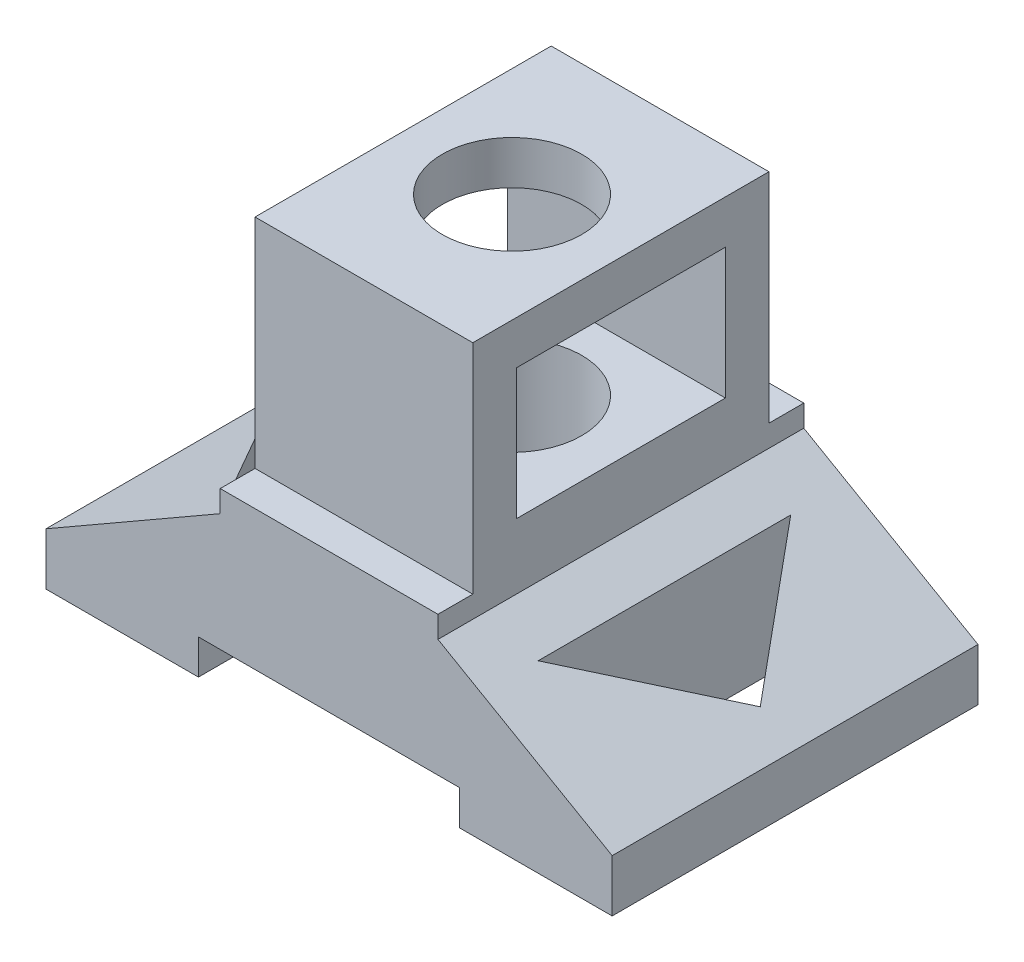
ISO-10303-21;
HEADER;
FILE_DESCRIPTION(('STEP AP214'),'2;1');
FILE_NAME('part.step','',(''),(''),'','','');
FILE_SCHEMA(('AUTOMOTIVE_DESIGN { 1 0 10303 214 1 1 1 1 }'));
ENDSEC;
DATA;
#1=APPLICATION_CONTEXT('core data for automotive mechanical design processes');
#2=APPLICATION_PROTOCOL_DEFINITION('international standard','automotive_design',2000,#1);
#3=PRODUCT_CONTEXT('',#1,'mechanical');
#4=PRODUCT('Part','Part','',(#3));
#5=PRODUCT_RELATED_PRODUCT_CATEGORY('part','',(#4));
#6=PRODUCT_DEFINITION_FORMATION('','',#4);
#7=PRODUCT_DEFINITION_CONTEXT('part definition',#1,'design');
#8=PRODUCT_DEFINITION('design','',#6,#7);
#9=PRODUCT_DEFINITION_SHAPE('','',#8);
#10=(LENGTH_UNIT() NAMED_UNIT(*) SI_UNIT(.MILLI.,.METRE.));
#11=(NAMED_UNIT(*) PLANE_ANGLE_UNIT() SI_UNIT($,.RADIAN.));
#12=(NAMED_UNIT(*) SI_UNIT($,.STERADIAN.) SOLID_ANGLE_UNIT());
#13=UNCERTAINTY_MEASURE_WITH_UNIT(LENGTH_MEASURE(1.E-05),#10,'distance_accuracy_value','');
#14=(GEOMETRIC_REPRESENTATION_CONTEXT(3) GLOBAL_UNCERTAINTY_ASSIGNED_CONTEXT((#13)) GLOBAL_UNIT_ASSIGNED_CONTEXT((#10,
#11,#12)) REPRESENTATION_CONTEXT('',''));
#15=CARTESIAN_POINT('',(0.,0.,0.));
#16=DIRECTION('',(0.,0.,1.));
#17=DIRECTION('',(1.,0.,0.));
#18=AXIS2_PLACEMENT_3D('',#15,#16,#17);
#19=CARTESIAN_POINT('',(0.,40.,-42.));
#20=DIRECTION('',(0.,-1.,0.));
#21=DIRECTION('',(1.,0.,0.));
#22=AXIS2_PLACEMENT_3D('',#19,#20,#21);
#23=PLANE('',#22);
#24=DIRECTION('',(1.,0.,0.));
#25=VECTOR('',#24,1.);
#26=CARTESIAN_POINT('',(0.,40.,34.));
#27=LINE('',#26,#25);
#28=CARTESIAN_POINT('',(-25.,40.,34.));
#29=VERTEX_POINT('',#28);
#30=CARTESIAN_POINT('',(25.,40.,34.));
#31=VERTEX_POINT('',#30);
#32=EDGE_CURVE('E326',#29,#31,#27,.T.);
#33=ORIENTED_EDGE('',*,*,#32,.F.);
#34=DIRECTION('',(0.,0.,1.));
#35=VECTOR('',#34,1.);
#36=CARTESIAN_POINT('',(-25.,40.,-42.));
#37=LINE('',#36,#35);
#38=CARTESIAN_POINT('',(-25.,40.,42.));
#39=VERTEX_POINT('',#38);
#40=EDGE_CURVE('E448',#29,#39,#37,.T.);
#41=ORIENTED_EDGE('',*,*,#40,.T.);
#42=DIRECTION('',(1.,0.,0.));
#43=VECTOR('',#42,1.);
#44=CARTESIAN_POINT('',(0.,40.,42.));
#45=LINE('',#44,#43);
#46=CARTESIAN_POINT('',(25.,40.,42.));
#47=VERTEX_POINT('',#46);
#48=EDGE_CURVE('E356',#39,#47,#45,.T.);
#49=ORIENTED_EDGE('',*,*,#48,.T.);
#50=DIRECTION('',(0.,0.,1.));
#51=VECTOR('',#50,1.);
#52=CARTESIAN_POINT('',(25.,40.,-42.));
#53=LINE('',#52,#51);
#54=EDGE_CURVE('E454',#31,#47,#53,.T.);
#55=ORIENTED_EDGE('',*,*,#54,.F.);
#56=EDGE_LOOP('',(#33,#41,#49,#55));
#57=FACE_BOUND('',#56,.T.);
#58=ADVANCED_FACE('F47',(#57),#23,.F.);
#59=CARTESIAN_POINT('',(-25.,40.,-42.));
#60=VERTEX_POINT('',#59);
#61=CARTESIAN_POINT('',(-25.,40.,-34.));
#62=VERTEX_POINT('',#61);
#63=EDGE_CURVE('E485',#60,#62,#37,.T.);
#64=ORIENTED_EDGE('',*,*,#63,.T.);
#65=DIRECTION('',(1.,0.,0.));
#66=VECTOR('',#65,1.);
#67=CARTESIAN_POINT('',(0.,40.,-34.));
#68=LINE('',#67,#66);
#69=CARTESIAN_POINT('',(25.,40.,-34.));
#70=VERTEX_POINT('',#69);
#71=EDGE_CURVE('E340',#62,#70,#68,.T.);
#72=ORIENTED_EDGE('',*,*,#71,.T.);
#73=CARTESIAN_POINT('',(25.,40.,-42.));
#74=VERTEX_POINT('',#73);
#75=EDGE_CURVE('E449',#74,#70,#53,.T.);
#76=ORIENTED_EDGE('',*,*,#75,.F.);
#77=DIRECTION('',(1.,0.,0.));
#78=VECTOR('',#77,1.);
#79=CARTESIAN_POINT('',(0.,40.,-42.));
#80=LINE('',#79,#78);
#81=EDGE_CURVE('E406',#60,#74,#80,.T.);
#82=ORIENTED_EDGE('',*,*,#81,.F.);
#83=EDGE_LOOP('',(#64,#72,#76,#82));
#84=FACE_BOUND('',#83,.T.);
#85=ADVANCED_FACE('F49',(#84),#23,.F.);
#86=CARTESIAN_POINT('',(25.,0.,-42.));
#87=DIRECTION('',(1.,0.,0.));
#88=DIRECTION('',(0.,0.,-1.));
#89=AXIS2_PLACEMENT_3D('',#86,#87,#88);
#90=PLANE('',#89);
#91=DIRECTION('',(0.,-1.,0.));
#92=VECTOR('',#91,1.);
#93=CARTESIAN_POINT('',(25.,80.,24.));
#94=LINE('',#93,#92);
#95=CARTESIAN_POINT('',(25.,80.,24.));
#96=VERTEX_POINT('',#95);
#97=CARTESIAN_POINT('',(25.,50.,24.));
#98=VERTEX_POINT('',#97);
#99=EDGE_CURVE('E294',#96,#98,#94,.T.);
#100=ORIENTED_EDGE('',*,*,#99,.F.);
#101=DIRECTION('',(0.,0.,1.));
#102=VECTOR('',#101,1.);
#103=CARTESIAN_POINT('',(25.,80.,24.));
#104=LINE('',#103,#102);
#105=CARTESIAN_POINT('',(25.,80.,-24.));
#106=VERTEX_POINT('',#105);
#107=EDGE_CURVE('E305',#106,#96,#104,.T.);
#108=ORIENTED_EDGE('',*,*,#107,.F.);
#109=DIRECTION('',(0.,1.,0.));
#110=VECTOR('',#109,1.);
#111=CARTESIAN_POINT('',(25.,80.,-24.));
#112=LINE('',#111,#110);
#113=CARTESIAN_POINT('',(25.,50.,-24.));
#114=VERTEX_POINT('',#113);
#115=EDGE_CURVE('E301',#114,#106,#112,.T.);
#116=ORIENTED_EDGE('',*,*,#115,.F.);
#117=DIRECTION('',(0.,0.,-1.));
#118=VECTOR('',#117,1.);
#119=CARTESIAN_POINT('',(25.,50.,24.));
#120=LINE('',#119,#118);
#121=EDGE_CURVE('E297',#98,#114,#120,.T.);
#122=ORIENTED_EDGE('',*,*,#121,.F.);
#123=EDGE_LOOP('',(#100,#108,#116,#122));
#124=FACE_BOUND('',#123,.T.);
#125=ORIENTED_EDGE('',*,*,#75,.T.);
#126=DIRECTION('',(0.,1.,0.));
#127=VECTOR('',#126,1.);
#128=CARTESIAN_POINT('',(25.,0.,-34.));
#129=LINE('',#128,#127);
#130=CARTESIAN_POINT('',(25.,90.,-34.));
#131=VERTEX_POINT('',#130);
#132=EDGE_CURVE('E344',#70,#131,#129,.T.);
#133=ORIENTED_EDGE('',*,*,#132,.T.);
#134=DIRECTION('',(0.,0.,1.));
#135=VECTOR('',#134,1.);
#136=CARTESIAN_POINT('',(25.,90.,-34.));
#137=LINE('',#136,#135);
#138=CARTESIAN_POINT('',(25.,90.,34.));
#139=VERTEX_POINT('',#138);
#140=EDGE_CURVE('E352',#131,#139,#137,.T.);
#141=ORIENTED_EDGE('',*,*,#140,.T.);
#142=DIRECTION('',(0.,1.,0.));
#143=VECTOR('',#142,1.);
#144=CARTESIAN_POINT('',(25.,0.,34.));
#145=LINE('',#144,#143);
#146=EDGE_CURVE('E329',#31,#139,#145,.T.);
#147=ORIENTED_EDGE('',*,*,#146,.F.);
#148=ORIENTED_EDGE('',*,*,#54,.T.);
#149=DIRECTION('',(0.,1.,0.));
#150=VECTOR('',#149,1.);
#151=CARTESIAN_POINT('',(25.,0.,42.));
#152=LINE('',#151,#150);
#153=CARTESIAN_POINT('',(25.,35.,42.));
#154=VERTEX_POINT('',#153);
#155=EDGE_CURVE('E402',#154,#47,#152,.T.);
#156=ORIENTED_EDGE('',*,*,#155,.F.);
#157=DIRECTION('',(0.,0.,1.));
#158=VECTOR('',#157,1.);
#159=CARTESIAN_POINT('',(25.,35.,-42.));
#160=LINE('',#159,#158);
#161=CARTESIAN_POINT('',(25.,35.,-42.));
#162=VERTEX_POINT('',#161);
#163=EDGE_CURVE('E455',#162,#154,#160,.T.);
#164=ORIENTED_EDGE('',*,*,#163,.F.);
#165=DIRECTION('',(0.,1.,0.));
#166=VECTOR('',#165,1.);
#167=CARTESIAN_POINT('',(25.,0.,-42.));
#168=LINE('',#167,#166);
#169=EDGE_CURVE('E444',#162,#74,#168,.T.);
#170=ORIENTED_EDGE('',*,*,#169,.T.);
#171=EDGE_LOOP('',(#125,#133,#141,#147,#148,#156,#164,#170));
#172=FACE_BOUND('',#171,.T.);
#173=ADVANCED_FACE('F535',(#124,#172),#90,.T.);
#174=CARTESIAN_POINT('',(21.3363081258807,37.1066228276186,-42.));
#175=DIRECTION('',(0.498471124258083,0.866906303057535,0.));
#176=DIRECTION('',(-0.866906303057535,0.498471124258083,0.));
#177=AXIS2_PLACEMENT_3D('',#174,#175,#176);
#178=PLANE('',#177);
#179=DIRECTION('',(-0.570894900773463,0.328264567944741,-0.752543278292292));
#180=VECTOR('',#179,1.);
#181=CARTESIAN_POINT('',(23.4892484794001,35.8686821243449,-44.1732633680634));
#182=LINE('',#181,#180);
#183=CARTESIAN_POINT('',(57.,16.6,0.));
#184=VERTEX_POINT('',#183);
#185=CARTESIAN_POINT('',(35.,29.25,-29.));
#186=VERTEX_POINT('',#185);
#187=EDGE_CURVE('E291',#184,#186,#182,.T.);
#188=ORIENTED_EDGE('',*,*,#187,.F.);
#189=DIRECTION('',(0.570894900773463,-0.328264567944741,-0.752543278292292));
#190=VECTOR('',#189,1.);
#191=CARTESIAN_POINT('',(59.577590575227,15.1178854192445,-3.39773303098101));
#192=LINE('',#191,#190);
#193=CARTESIAN_POINT('',(35.,29.25,29.));
#194=VERTEX_POINT('',#193);
#195=EDGE_CURVE('E285',#194,#184,#192,.T.);
#196=ORIENTED_EDGE('',*,*,#195,.F.);
#197=DIRECTION('',(0.,0.,1.));
#198=VECTOR('',#197,1.);
#199=CARTESIAN_POINT('',(35.,29.25,-42.));
#200=LINE('',#199,#198);
#201=EDGE_CURVE('E288',#186,#194,#200,.T.);
#202=ORIENTED_EDGE('',*,*,#201,.F.);
#203=EDGE_LOOP('',(#188,#196,#202));
#204=FACE_BOUND('',#203,.T.);
#205=ORIENTED_EDGE('',*,*,#163,.T.);
#206=DIRECTION('',(-0.866906303057535,0.498471124258083,0.));
#207=VECTOR('',#206,1.);
#208=CARTESIAN_POINT('',(21.3363081258807,37.1066228276186,42.));
#209=LINE('',#208,#207);
#210=CARTESIAN_POINT('',(65.,12.,42.));
#211=VERTEX_POINT('',#210);
#212=EDGE_CURVE('E398',#211,#154,#209,.T.);
#213=ORIENTED_EDGE('',*,*,#212,.F.);
#214=DIRECTION('',(0.,0.,1.));
#215=VECTOR('',#214,1.);
#216=CARTESIAN_POINT('',(65.,12.,-42.));
#217=LINE('',#216,#215);
#218=CARTESIAN_POINT('',(65.,12.,-42.));
#219=VERTEX_POINT('',#218);
#220=EDGE_CURVE('E458',#219,#211,#217,.T.);
#221=ORIENTED_EDGE('',*,*,#220,.F.);
#222=DIRECTION('',(-0.866906303057535,0.498471124258083,0.));
#223=VECTOR('',#222,1.);
#224=CARTESIAN_POINT('',(21.3363081258807,37.1066228276186,-42.));
#225=LINE('',#224,#223);
#226=EDGE_CURVE('E440',#219,#162,#225,.T.);
#227=ORIENTED_EDGE('',*,*,#226,.T.);
#228=EDGE_LOOP('',(#205,#213,#221,#227));
#229=FACE_BOUND('',#228,.T.);
#230=ADVANCED_FACE('F556',(#204,#229),#178,.T.);
#231=CARTESIAN_POINT('',(65.,0.,-42.));
#232=DIRECTION('',(1.,0.,0.));
#233=DIRECTION('',(0.,0.,-1.));
#234=AXIS2_PLACEMENT_3D('',#231,#232,#233);
#235=PLANE('',#234);
#236=ORIENTED_EDGE('',*,*,#220,.T.);
#237=DIRECTION('',(0.,1.,0.));
#238=VECTOR('',#237,1.);
#239=CARTESIAN_POINT('',(65.,0.,42.));
#240=LINE('',#239,#238);
#241=CARTESIAN_POINT('',(65.,0.,42.));
#242=VERTEX_POINT('',#241);
#243=EDGE_CURVE('E394',#242,#211,#240,.T.);
#244=ORIENTED_EDGE('',*,*,#243,.F.);
#245=DIRECTION('',(0.,0.,1.));
#246=VECTOR('',#245,1.);
#247=CARTESIAN_POINT('',(65.,0.,-42.));
#248=LINE('',#247,#246);
#249=CARTESIAN_POINT('',(65.,0.,-42.));
#250=VERTEX_POINT('',#249);
#251=EDGE_CURVE('E461',#250,#242,#248,.T.);
#252=ORIENTED_EDGE('',*,*,#251,.F.);
#253=DIRECTION('',(0.,1.,0.));
#254=VECTOR('',#253,1.);
#255=CARTESIAN_POINT('',(65.,0.,-42.));
#256=LINE('',#255,#254);
#257=EDGE_CURVE('E436',#250,#219,#256,.T.);
#258=ORIENTED_EDGE('',*,*,#257,.T.);
#259=EDGE_LOOP('',(#236,#244,#252,#258));
#260=FACE_BOUND('',#259,.T.);
#261=ADVANCED_FACE('F602',(#260),#235,.T.);
#262=CARTESIAN_POINT('',(0.,0.,-42.));
#263=DIRECTION('',(0.,-1.,0.));
#264=DIRECTION('',(1.,0.,0.));
#265=AXIS2_PLACEMENT_3D('',#262,#263,#264);
#266=PLANE('',#265);
#267=DIRECTION('',(0.604386481374232,0.,0.796691270902396));
#268=VECTOR('',#267,1.);
#269=CARTESIAN_POINT('',(57.,0.,0.));
#270=LINE('',#269,#268);
#271=CARTESIAN_POINT('',(35.,0.,-29.));
#272=VERTEX_POINT('',#271);
#273=CARTESIAN_POINT('',(57.,0.,0.));
#274=VERTEX_POINT('',#273);
#275=EDGE_CURVE('E71',#272,#274,#270,.T.);
#276=ORIENTED_EDGE('',*,*,#275,.F.);
#277=DIRECTION('',(0.,0.,-1.));
#278=VECTOR('',#277,1.);
#279=CARTESIAN_POINT('',(35.,0.,-29.));
#280=LINE('',#279,#278);
#281=CARTESIAN_POINT('',(35.,0.,29.));
#282=VERTEX_POINT('',#281);
#283=EDGE_CURVE('E259',#282,#272,#280,.T.);
#284=ORIENTED_EDGE('',*,*,#283,.F.);
#285=DIRECTION('',(-0.604386481374232,0.,0.796691270902396));
#286=VECTOR('',#285,1.);
#287=CARTESIAN_POINT('',(35.,0.,29.));
#288=LINE('',#287,#286);
#289=EDGE_CURVE('E269',#274,#282,#288,.T.);
#290=ORIENTED_EDGE('',*,*,#289,.F.);
#291=EDGE_LOOP('',(#276,#284,#290));
#292=FACE_BOUND('',#291,.T.);
#293=ORIENTED_EDGE('',*,*,#251,.T.);
#294=DIRECTION('',(1.,0.,0.));
#295=VECTOR('',#294,1.);
#296=CARTESIAN_POINT('',(0.,0.,42.));
#297=LINE('',#296,#295);
#298=CARTESIAN_POINT('',(30.,0.,42.));
#299=VERTEX_POINT('',#298);
#300=EDGE_CURVE('E390',#299,#242,#297,.T.);
#301=ORIENTED_EDGE('',*,*,#300,.F.);
#302=DIRECTION('',(0.,0.,1.));
#303=VECTOR('',#302,1.);
#304=CARTESIAN_POINT('',(30.,0.,-42.));
#305=LINE('',#304,#303);
#306=CARTESIAN_POINT('',(30.,0.,-42.));
#307=VERTEX_POINT('',#306);
#308=EDGE_CURVE('E464',#307,#299,#305,.T.);
#309=ORIENTED_EDGE('',*,*,#308,.F.);
#310=DIRECTION('',(1.,0.,0.));
#311=VECTOR('',#310,1.);
#312=CARTESIAN_POINT('',(0.,0.,-42.));
#313=LINE('',#312,#311);
#314=EDGE_CURVE('E432',#307,#250,#313,.T.);
#315=ORIENTED_EDGE('',*,*,#314,.T.);
#316=EDGE_LOOP('',(#293,#301,#309,#315));
#317=FACE_BOUND('',#316,.T.);
#318=ADVANCED_FACE('F600',(#292,#317),#266,.T.);
#319=CARTESIAN_POINT('',(30.,0.,-42.));
#320=DIRECTION('',(-1.,0.,0.));
#321=DIRECTION('',(0.,-1.,0.));
#322=AXIS2_PLACEMENT_3D('',#319,#320,#321);
#323=PLANE('',#322);
#324=ORIENTED_EDGE('',*,*,#308,.T.);
#325=DIRECTION('',(0.,-1.,0.));
#326=VECTOR('',#325,1.);
#327=CARTESIAN_POINT('',(30.,0.,42.));
#328=LINE('',#327,#326);
#329=CARTESIAN_POINT('',(30.,8.,42.));
#330=VERTEX_POINT('',#329);
#331=EDGE_CURVE('E386',#330,#299,#328,.T.);
#332=ORIENTED_EDGE('',*,*,#331,.F.);
#333=DIRECTION('',(0.,0.,1.));
#334=VECTOR('',#333,1.);
#335=CARTESIAN_POINT('',(30.,8.,-42.));
#336=LINE('',#335,#334);
#337=CARTESIAN_POINT('',(30.,8.,-42.));
#338=VERTEX_POINT('',#337);
#339=EDGE_CURVE('E467',#338,#330,#336,.T.);
#340=ORIENTED_EDGE('',*,*,#339,.F.);
#341=DIRECTION('',(0.,-1.,0.));
#342=VECTOR('',#341,1.);
#343=CARTESIAN_POINT('',(30.,0.,-42.));
#344=LINE('',#343,#342);
#345=EDGE_CURVE('E428',#338,#307,#344,.T.);
#346=ORIENTED_EDGE('',*,*,#345,.T.);
#347=EDGE_LOOP('',(#324,#332,#340,#346));
#348=FACE_BOUND('',#347,.T.);
#349=ADVANCED_FACE('F596',(#348),#323,.T.);
#350=CARTESIAN_POINT('',(0.,8.,-42.));
#351=DIRECTION('',(0.,-1.,0.));
#352=DIRECTION('',(0.,0.,-1.));
#353=AXIS2_PLACEMENT_3D('',#350,#351,#352);
#354=PLANE('',#353);
#355=CARTESIAN_POINT('',(0.,8.00000000000002,0.));
#356=DIRECTION('',(0.,-1.,0.));
#357=DIRECTION('',(0.,0.,-1.));
#358=AXIS2_PLACEMENT_3D('',#355,#356,#357);
#359=CIRCLE('',#358,16.);
#360=CARTESIAN_POINT('',(16.,8.00000000000002,0.));
#361=VERTEX_POINT('',#360);
#362=EDGE_CURVE('E281',#361,#361,#359,.T.);
#363=ORIENTED_EDGE('',*,*,#362,.F.);
#364=EDGE_LOOP('',(#363));
#365=FACE_BOUND('',#364,.T.);
#366=ORIENTED_EDGE('',*,*,#339,.T.);
#367=DIRECTION('',(1.,0.,0.));
#368=VECTOR('',#367,1.);
#369=CARTESIAN_POINT('',(0.,8.,42.));
#370=LINE('',#369,#368);
#371=CARTESIAN_POINT('',(-30.,8.,42.));
#372=VERTEX_POINT('',#371);
#373=EDGE_CURVE('E382',#372,#330,#370,.T.);
#374=ORIENTED_EDGE('',*,*,#373,.F.);
#375=DIRECTION('',(0.,0.,1.));
#376=VECTOR('',#375,1.);
#377=CARTESIAN_POINT('',(-30.,8.,-42.));
#378=LINE('',#377,#376);
#379=CARTESIAN_POINT('',(-30.,8.,-42.));
#380=VERTEX_POINT('',#379);
#381=EDGE_CURVE('E470',#380,#372,#378,.T.);
#382=ORIENTED_EDGE('',*,*,#381,.F.);
#383=DIRECTION('',(1.,0.,0.));
#384=VECTOR('',#383,1.);
#385=CARTESIAN_POINT('',(0.,8.,-42.));
#386=LINE('',#385,#384);
#387=EDGE_CURVE('E424',#380,#338,#386,.T.);
#388=ORIENTED_EDGE('',*,*,#387,.T.);
#389=EDGE_LOOP('',(#366,#374,#382,#388));
#390=FACE_BOUND('',#389,.T.);
#391=ADVANCED_FACE('F617',(#365,#390),#354,.T.);
#392=CARTESIAN_POINT('',(-30.,0.,-42.));
#393=DIRECTION('',(-1.,0.,0.));
#394=DIRECTION('',(0.,-1.,0.));
#395=AXIS2_PLACEMENT_3D('',#392,#393,#394);
#396=PLANE('',#395);
#397=ORIENTED_EDGE('',*,*,#381,.T.);
#398=DIRECTION('',(0.,-1.,0.));
#399=VECTOR('',#398,1.);
#400=CARTESIAN_POINT('',(-30.,0.,42.));
#401=LINE('',#400,#399);
#402=CARTESIAN_POINT('',(-30.,0.,42.));
#403=VERTEX_POINT('',#402);
#404=EDGE_CURVE('E378',#372,#403,#401,.T.);
#405=ORIENTED_EDGE('',*,*,#404,.T.);
#406=DIRECTION('',(0.,0.,1.));
#407=VECTOR('',#406,1.);
#408=CARTESIAN_POINT('',(-30.,0.,-42.));
#409=LINE('',#408,#407);
#410=CARTESIAN_POINT('',(-30.,0.,-42.));
#411=VERTEX_POINT('',#410);
#412=EDGE_CURVE('E473',#411,#403,#409,.T.);
#413=ORIENTED_EDGE('',*,*,#412,.F.);
#414=DIRECTION('',(0.,-1.,0.));
#415=VECTOR('',#414,1.);
#416=CARTESIAN_POINT('',(-30.,0.,-42.));
#417=LINE('',#416,#415);
#418=EDGE_CURVE('E421',#380,#411,#417,.T.);
#419=ORIENTED_EDGE('',*,*,#418,.F.);
#420=EDGE_LOOP('',(#397,#405,#413,#419));
#421=FACE_BOUND('',#420,.T.);
#422=ADVANCED_FACE('F589',(#421),#396,.F.);
#423=CARTESIAN_POINT('',(0.,0.,-42.));
#424=DIRECTION('',(0.,1.,0.));
#425=DIRECTION('',(-1.,0.,0.));
#426=AXIS2_PLACEMENT_3D('',#423,#424,#425);
#427=PLANE('',#426);
#428=DIRECTION('',(-0.604386481374232,0.,-0.796691270902396));
#429=VECTOR('',#428,1.);
#430=CARTESIAN_POINT('',(-35.,0.,29.));
#431=LINE('',#430,#429);
#432=CARTESIAN_POINT('',(-35.,0.,29.));
#433=VERTEX_POINT('',#432);
#434=CARTESIAN_POINT('',(-57.,0.,0.));
#435=VERTEX_POINT('',#434);
#436=EDGE_CURVE('E238',#433,#435,#431,.T.);
#437=ORIENTED_EDGE('',*,*,#436,.F.);
#438=DIRECTION('',(0.,0.,1.));
#439=VECTOR('',#438,1.);
#440=CARTESIAN_POINT('',(-35.,0.,-29.));
#441=LINE('',#440,#439);
#442=CARTESIAN_POINT('',(-35.,0.,-29.));
#443=VERTEX_POINT('',#442);
#444=EDGE_CURVE('E243',#443,#433,#441,.T.);
#445=ORIENTED_EDGE('',*,*,#444,.F.);
#446=DIRECTION('',(0.604386481374232,0.,-0.796691270902396));
#447=VECTOR('',#446,1.);
#448=CARTESIAN_POINT('',(-57.,0.,0.));
#449=LINE('',#448,#447);
#450=EDGE_CURVE('E227',#435,#443,#449,.T.);
#451=ORIENTED_EDGE('',*,*,#450,.F.);
#452=EDGE_LOOP('',(#437,#445,#451));
#453=FACE_BOUND('',#452,.T.);
#454=ORIENTED_EDGE('',*,*,#412,.T.);
#455=DIRECTION('',(-1.,0.,0.));
#456=VECTOR('',#455,1.);
#457=CARTESIAN_POINT('',(0.,0.,42.));
#458=LINE('',#457,#456);
#459=CARTESIAN_POINT('',(-65.,0.,42.));
#460=VERTEX_POINT('',#459);
#461=EDGE_CURVE('E374',#403,#460,#458,.T.);
#462=ORIENTED_EDGE('',*,*,#461,.T.);
#463=DIRECTION('',(0.,0.,1.));
#464=VECTOR('',#463,1.);
#465=CARTESIAN_POINT('',(-65.,0.,-42.));
#466=LINE('',#465,#464);
#467=CARTESIAN_POINT('',(-65.,0.,-42.));
#468=VERTEX_POINT('',#467);
#469=EDGE_CURVE('E476',#468,#460,#466,.T.);
#470=ORIENTED_EDGE('',*,*,#469,.F.);
#471=DIRECTION('',(-1.,0.,0.));
#472=VECTOR('',#471,1.);
#473=CARTESIAN_POINT('',(0.,0.,-42.));
#474=LINE('',#473,#472);
#475=EDGE_CURVE('E418',#411,#468,#474,.T.);
#476=ORIENTED_EDGE('',*,*,#475,.F.);
#477=EDGE_LOOP('',(#454,#462,#470,#476));
#478=FACE_BOUND('',#477,.T.);
#479=ADVANCED_FACE('F245',(#453,#478),#427,.F.);
#480=CARTESIAN_POINT('',(-65.,0.,-42.));
#481=DIRECTION('',(1.,0.,0.));
#482=DIRECTION('',(0.,0.,-1.));
#483=AXIS2_PLACEMENT_3D('',#480,#481,#482);
#484=PLANE('',#483);
#485=ORIENTED_EDGE('',*,*,#469,.T.);
#486=DIRECTION('',(0.,1.,0.));
#487=VECTOR('',#486,1.);
#488=CARTESIAN_POINT('',(-65.,0.,42.));
#489=LINE('',#488,#487);
#490=CARTESIAN_POINT('',(-65.,12.,42.));
#491=VERTEX_POINT('',#490);
#492=EDGE_CURVE('E370',#460,#491,#489,.T.);
#493=ORIENTED_EDGE('',*,*,#492,.T.);
#494=DIRECTION('',(0.,0.,1.));
#495=VECTOR('',#494,1.);
#496=CARTESIAN_POINT('',(-65.,12.,-42.));
#497=LINE('',#496,#495);
#498=CARTESIAN_POINT('',(-65.,12.,-42.));
#499=VERTEX_POINT('',#498);
#500=EDGE_CURVE('E479',#499,#491,#497,.T.);
#501=ORIENTED_EDGE('',*,*,#500,.F.);
#502=DIRECTION('',(0.,1.,0.));
#503=VECTOR('',#502,1.);
#504=CARTESIAN_POINT('',(-65.,0.,-42.));
#505=LINE('',#504,#503);
#506=EDGE_CURVE('E415',#468,#499,#505,.T.);
#507=ORIENTED_EDGE('',*,*,#506,.F.);
#508=EDGE_LOOP('',(#485,#493,#501,#507));
#509=FACE_BOUND('',#508,.T.);
#510=ADVANCED_FACE('F581',(#509),#484,.F.);
#511=CARTESIAN_POINT('',(-21.3363081258807,37.1066228276186,-42.));
#512=DIRECTION('',(0.498471124258082,-0.866906303057535,0.));
#513=DIRECTION('',(0.866906303057535,0.498471124258083,0.));
#514=AXIS2_PLACEMENT_3D('',#511,#512,#513);
#515=PLANE('',#514);
#516=DIRECTION('',(0.570894900773463,0.328264567944741,-0.752543278292292));
#517=VECTOR('',#516,1.);
#518=CARTESIAN_POINT('',(-23.4892484794001,35.8686821243449,-44.1732633680635));
#519=LINE('',#518,#517);
#520=CARTESIAN_POINT('',(-57.,16.6,0.));
#521=VERTEX_POINT('',#520);
#522=CARTESIAN_POINT('',(-35.,29.25,-29.));
#523=VERTEX_POINT('',#522);
#524=EDGE_CURVE('E56',#521,#523,#519,.T.);
#525=ORIENTED_EDGE('',*,*,#524,.T.);
#526=DIRECTION('',(0.,0.,1.));
#527=VECTOR('',#526,1.);
#528=CARTESIAN_POINT('',(-35.,29.25,-42.));
#529=LINE('',#528,#527);
#530=CARTESIAN_POINT('',(-35.,29.25,29.));
#531=VERTEX_POINT('',#530);
#532=EDGE_CURVE('E11',#523,#531,#529,.T.);
#533=ORIENTED_EDGE('',*,*,#532,.T.);
#534=DIRECTION('',(-0.570894900773463,-0.328264567944741,-0.752543278292292));
#535=VECTOR('',#534,1.);
#536=CARTESIAN_POINT('',(-59.577590575227,15.1178854192445,-3.39773303098101));
#537=LINE('',#536,#535);
#538=EDGE_CURVE('E504',#531,#521,#537,.T.);
#539=ORIENTED_EDGE('',*,*,#538,.T.);
#540=EDGE_LOOP('',(#525,#533,#539));
#541=FACE_BOUND('',#540,.T.);
#542=ORIENTED_EDGE('',*,*,#500,.T.);
#543=DIRECTION('',(0.866906303057535,0.498471124258082,0.));
#544=VECTOR('',#543,1.);
#545=CARTESIAN_POINT('',(-21.3363081258807,37.1066228276186,42.));
#546=LINE('',#545,#544);
#547=CARTESIAN_POINT('',(-25.,35.,42.));
#548=VERTEX_POINT('',#547);
#549=EDGE_CURVE('E366',#491,#548,#546,.T.);
#550=ORIENTED_EDGE('',*,*,#549,.T.);
#551=DIRECTION('',(0.,0.,1.));
#552=VECTOR('',#551,1.);
#553=CARTESIAN_POINT('',(-25.,35.,-42.));
#554=LINE('',#553,#552);
#555=CARTESIAN_POINT('',(-25.,35.,-42.));
#556=VERTEX_POINT('',#555);
#557=EDGE_CURVE('E482',#556,#548,#554,.T.);
#558=ORIENTED_EDGE('',*,*,#557,.F.);
#559=DIRECTION('',(0.866906303057535,0.498471124258082,0.));
#560=VECTOR('',#559,1.);
#561=CARTESIAN_POINT('',(-21.3363081258807,37.1066228276186,-42.));
#562=LINE('',#561,#560);
#563=EDGE_CURVE('E412',#499,#556,#562,.T.);
#564=ORIENTED_EDGE('',*,*,#563,.F.);
#565=EDGE_LOOP('',(#542,#550,#558,#564));
#566=FACE_BOUND('',#565,.T.);
#567=ADVANCED_FACE('F511',(#541,#566),#515,.F.);
#568=CARTESIAN_POINT('',(-25.,0.,-42.));
#569=DIRECTION('',(1.,0.,0.));
#570=DIRECTION('',(0.,1.,0.));
#571=AXIS2_PLACEMENT_3D('',#568,#569,#570);
#572=PLANE('',#571);
#573=DIRECTION('',(0.,0.,1.));
#574=VECTOR('',#573,1.);
#575=CARTESIAN_POINT('',(-25.,80.,-42.));
#576=LINE('',#575,#574);
#577=CARTESIAN_POINT('',(-25.,80.,-24.));
#578=VERTEX_POINT('',#577);
#579=CARTESIAN_POINT('',(-25.,80.,24.));
#580=VERTEX_POINT('',#579);
#581=EDGE_CURVE('E496',#578,#580,#576,.T.);
#582=ORIENTED_EDGE('',*,*,#581,.T.);
#583=DIRECTION('',(0.,-1.,0.));
#584=VECTOR('',#583,1.);
#585=CARTESIAN_POINT('',(-25.,0.,24.));
#586=LINE('',#585,#584);
#587=CARTESIAN_POINT('',(-25.,50.,24.));
#588=VERTEX_POINT('',#587);
#589=EDGE_CURVE('E500',#580,#588,#586,.T.);
#590=ORIENTED_EDGE('',*,*,#589,.T.);
#591=DIRECTION('',(0.,0.,-1.));
#592=VECTOR('',#591,1.);
#593=CARTESIAN_POINT('',(-25.,50.,-42.));
#594=LINE('',#593,#592);
#595=CARTESIAN_POINT('',(-25.,50.,-24.));
#596=VERTEX_POINT('',#595);
#597=EDGE_CURVE('E453',#588,#596,#594,.T.);
#598=ORIENTED_EDGE('',*,*,#597,.T.);
#599=DIRECTION('',(0.,1.,0.));
#600=VECTOR('',#599,1.);
#601=CARTESIAN_POINT('',(-25.,0.,-24.));
#602=LINE('',#601,#600);
#603=EDGE_CURVE('E492',#596,#578,#602,.T.);
#604=ORIENTED_EDGE('',*,*,#603,.T.);
#605=EDGE_LOOP('',(#582,#590,#598,#604));
#606=FACE_BOUND('',#605,.T.);
#607=ORIENTED_EDGE('',*,*,#557,.T.);
#608=DIRECTION('',(0.,1.,0.));
#609=VECTOR('',#608,1.);
#610=CARTESIAN_POINT('',(-25.,0.,42.));
#611=LINE('',#610,#609);
#612=EDGE_CURVE('E362',#548,#39,#611,.T.);
#613=ORIENTED_EDGE('',*,*,#612,.T.);
#614=ORIENTED_EDGE('',*,*,#40,.F.);
#615=DIRECTION('',(0.,1.,0.));
#616=VECTOR('',#615,1.);
#617=CARTESIAN_POINT('',(-25.,0.,34.));
#618=LINE('',#617,#616);
#619=CARTESIAN_POINT('',(-25.,90.,34.));
#620=VERTEX_POINT('',#619);
#621=EDGE_CURVE('E313',#29,#620,#618,.T.);
#622=ORIENTED_EDGE('',*,*,#621,.T.);
#623=DIRECTION('',(0.,0.,1.));
#624=VECTOR('',#623,1.);
#625=CARTESIAN_POINT('',(-25.,90.,-34.));
#626=LINE('',#625,#624);
#627=CARTESIAN_POINT('',(-25.,90.,-34.));
#628=VERTEX_POINT('',#627);
#629=EDGE_CURVE('E353',#628,#620,#626,.T.);
#630=ORIENTED_EDGE('',*,*,#629,.F.);
#631=DIRECTION('',(0.,1.,0.));
#632=VECTOR('',#631,1.);
#633=CARTESIAN_POINT('',(-25.,0.,-34.));
#634=LINE('',#633,#632);
#635=EDGE_CURVE('E337',#62,#628,#634,.T.);
#636=ORIENTED_EDGE('',*,*,#635,.F.);
#637=ORIENTED_EDGE('',*,*,#63,.F.);
#638=DIRECTION('',(0.,1.,0.));
#639=VECTOR('',#638,1.);
#640=CARTESIAN_POINT('',(-25.,0.,-42.));
#641=LINE('',#640,#639);
#642=EDGE_CURVE('E409',#556,#60,#641,.T.);
#643=ORIENTED_EDGE('',*,*,#642,.F.);
#644=EDGE_LOOP('',(#607,#613,#614,#622,#630,#636,#637,#643));
#645=FACE_BOUND('',#644,.T.);
#646=ADVANCED_FACE('F544',(#606,#645),#572,.F.);
#647=CARTESIAN_POINT('',(0.,0.,-42.));
#648=DIRECTION('',(0.,0.,1.));
#649=DIRECTION('',(1.,0.,0.));
#650=AXIS2_PLACEMENT_3D('',#647,#648,#649);
#651=PLANE('',#650);
#652=ORIENTED_EDGE('',*,*,#81,.T.);
#653=ORIENTED_EDGE('',*,*,#169,.F.);
#654=ORIENTED_EDGE('',*,*,#226,.F.);
#655=ORIENTED_EDGE('',*,*,#257,.F.);
#656=ORIENTED_EDGE('',*,*,#314,.F.);
#657=ORIENTED_EDGE('',*,*,#345,.F.);
#658=ORIENTED_EDGE('',*,*,#387,.F.);
#659=ORIENTED_EDGE('',*,*,#418,.T.);
#660=ORIENTED_EDGE('',*,*,#475,.T.);
#661=ORIENTED_EDGE('',*,*,#506,.T.);
#662=ORIENTED_EDGE('',*,*,#563,.T.);
#663=ORIENTED_EDGE('',*,*,#642,.T.);
#664=EDGE_LOOP('',(#652,#653,#654,#655,#656,#657,#658,#659,#660,#661,#662,#663));
#665=FACE_BOUND('',#664,.T.);
#666=ADVANCED_FACE('F561',(#665),#651,.F.);
#667=CARTESIAN_POINT('',(0.,0.,42.));
#668=DIRECTION('',(0.,0.,1.));
#669=DIRECTION('',(1.,0.,0.));
#670=AXIS2_PLACEMENT_3D('',#667,#668,#669);
#671=PLANE('',#670);
#672=ORIENTED_EDGE('',*,*,#48,.F.);
#673=ORIENTED_EDGE('',*,*,#612,.F.);
#674=ORIENTED_EDGE('',*,*,#549,.F.);
#675=ORIENTED_EDGE('',*,*,#492,.F.);
#676=ORIENTED_EDGE('',*,*,#461,.F.);
#677=ORIENTED_EDGE('',*,*,#404,.F.);
#678=ORIENTED_EDGE('',*,*,#373,.T.);
#679=ORIENTED_EDGE('',*,*,#331,.T.);
#680=ORIENTED_EDGE('',*,*,#300,.T.);
#681=ORIENTED_EDGE('',*,*,#243,.T.);
#682=ORIENTED_EDGE('',*,*,#212,.T.);
#683=ORIENTED_EDGE('',*,*,#155,.T.);
#684=EDGE_LOOP('',(#672,#673,#674,#675,#676,#677,#678,#679,#680,#681,#682,#683));
#685=FACE_BOUND('',#684,.T.);
#686=ADVANCED_FACE('F552',(#685),#671,.T.);
#687=CARTESIAN_POINT('',(0.,90.,-34.));
#688=DIRECTION('',(0.,1.,0.));
#689=DIRECTION('',(0.,0.,1.));
#690=AXIS2_PLACEMENT_3D('',#687,#688,#689);
#691=PLANE('',#690);
#692=CARTESIAN_POINT('',(0.,90.,0.));
#693=DIRECTION('',(0.,-1.,0.));
#694=DIRECTION('',(1.,0.,0.));
#695=AXIS2_PLACEMENT_3D('',#692,#693,#694);
#696=CIRCLE('',#695,16.);
#697=CARTESIAN_POINT('',(16.,90.,0.));
#698=VERTEX_POINT('',#697);
#699=EDGE_CURVE('E265',#698,#698,#696,.T.);
#700=ORIENTED_EDGE('',*,*,#699,.T.);
#701=EDGE_LOOP('',(#700));
#702=FACE_BOUND('',#701,.T.);
#703=ORIENTED_EDGE('',*,*,#629,.T.);
#704=DIRECTION('',(-1.,0.,0.));
#705=VECTOR('',#704,1.);
#706=CARTESIAN_POINT('',(0.,90.,34.));
#707=LINE('',#706,#705);
#708=EDGE_CURVE('E333',#139,#620,#707,.T.);
#709=ORIENTED_EDGE('',*,*,#708,.F.);
#710=ORIENTED_EDGE('',*,*,#140,.F.);
#711=DIRECTION('',(-1.,0.,0.));
#712=VECTOR('',#711,1.);
#713=CARTESIAN_POINT('',(0.,90.,-34.));
#714=LINE('',#713,#712);
#715=EDGE_CURVE('E348',#131,#628,#714,.T.);
#716=ORIENTED_EDGE('',*,*,#715,.T.);
#717=EDGE_LOOP('',(#703,#709,#710,#716));
#718=FACE_BOUND('',#717,.T.);
#719=ADVANCED_FACE('F573',(#702,#718),#691,.T.);
#720=CARTESIAN_POINT('',(0.,0.,-34.));
#721=DIRECTION('',(0.,0.,1.));
#722=DIRECTION('',(1.,0.,0.));
#723=AXIS2_PLACEMENT_3D('',#720,#721,#722);
#724=PLANE('',#723);
#725=ORIENTED_EDGE('',*,*,#635,.T.);
#726=ORIENTED_EDGE('',*,*,#715,.F.);
#727=ORIENTED_EDGE('',*,*,#132,.F.);
#728=ORIENTED_EDGE('',*,*,#71,.F.);
#729=EDGE_LOOP('',(#725,#726,#727,#728));
#730=FACE_BOUND('',#729,.T.);
#731=ADVANCED_FACE('F568',(#730),#724,.F.);
#732=CARTESIAN_POINT('',(0.,0.,34.));
#733=DIRECTION('',(0.,0.,1.));
#734=DIRECTION('',(1.,0.,0.));
#735=AXIS2_PLACEMENT_3D('',#732,#733,#734);
#736=PLANE('',#735);
#737=ORIENTED_EDGE('',*,*,#621,.F.);
#738=ORIENTED_EDGE('',*,*,#32,.T.);
#739=ORIENTED_EDGE('',*,*,#146,.T.);
#740=ORIENTED_EDGE('',*,*,#708,.T.);
#741=EDGE_LOOP('',(#737,#738,#739,#740));
#742=FACE_BOUND('',#741,.T.);
#743=ADVANCED_FACE('F572',(#742),#736,.T.);
#744=CARTESIAN_POINT('',(-65.,80.,24.));
#745=DIRECTION('',(0.,0.,1.));
#746=DIRECTION('',(0.,-1.,0.));
#747=AXIS2_PLACEMENT_3D('',#744,#745,#746);
#748=PLANE('',#747);
#749=DIRECTION('',(1.,0.,0.));
#750=VECTOR('',#749,1.);
#751=CARTESIAN_POINT('',(-65.,80.,24.));
#752=LINE('',#751,#750);
#753=EDGE_CURVE('E310',#580,#96,#752,.T.);
#754=ORIENTED_EDGE('',*,*,#753,.T.);
#755=ORIENTED_EDGE('',*,*,#99,.T.);
#756=DIRECTION('',(1.,0.,0.));
#757=VECTOR('',#756,1.);
#758=CARTESIAN_POINT('',(-65.,50.,24.));
#759=LINE('',#758,#757);
#760=EDGE_CURVE('E309',#588,#98,#759,.T.);
#761=ORIENTED_EDGE('',*,*,#760,.F.);
#762=ORIENTED_EDGE('',*,*,#589,.F.);
#763=EDGE_LOOP('',(#754,#755,#761,#762));
#764=FACE_BOUND('',#763,.T.);
#765=ADVANCED_FACE('F650',(#764),#748,.F.);
#766=CARTESIAN_POINT('',(-65.,80.,24.));
#767=DIRECTION('',(0.,1.,0.));
#768=DIRECTION('',(0.,0.,1.));
#769=AXIS2_PLACEMENT_3D('',#766,#767,#768);
#770=PLANE('',#769);
#771=CARTESIAN_POINT('',(0.,80.,0.));
#772=DIRECTION('',(0.,1.,0.));
#773=DIRECTION('',(0.,0.,1.));
#774=AXIS2_PLACEMENT_3D('',#771,#772,#773);
#775=CIRCLE('',#774,16.);
#776=CARTESIAN_POINT('',(16.,80.,0.));
#777=VERTEX_POINT('',#776);
#778=EDGE_CURVE('E277',#777,#777,#775,.T.);
#779=ORIENTED_EDGE('',*,*,#778,.T.);
#780=EDGE_LOOP('',(#779));
#781=FACE_BOUND('',#780,.T.);
#782=DIRECTION('',(1.,0.,0.));
#783=VECTOR('',#782,1.);
#784=CARTESIAN_POINT('',(-65.,80.,-24.));
#785=LINE('',#784,#783);
#786=EDGE_CURVE('E314',#578,#106,#785,.T.);
#787=ORIENTED_EDGE('',*,*,#786,.T.);
#788=ORIENTED_EDGE('',*,*,#107,.T.);
#789=ORIENTED_EDGE('',*,*,#753,.F.);
#790=ORIENTED_EDGE('',*,*,#581,.F.);
#791=EDGE_LOOP('',(#787,#788,#789,#790));
#792=FACE_BOUND('',#791,.T.);
#793=ADVANCED_FACE('F640',(#781,#792),#770,.F.);
#794=CARTESIAN_POINT('',(-65.,80.,-24.));
#795=DIRECTION('',(0.,0.,-1.));
#796=DIRECTION('',(0.,1.,0.));
#797=AXIS2_PLACEMENT_3D('',#794,#795,#796);
#798=PLANE('',#797);
#799=DIRECTION('',(1.,0.,0.));
#800=VECTOR('',#799,1.);
#801=CARTESIAN_POINT('',(-65.,50.,-24.));
#802=LINE('',#801,#800);
#803=EDGE_CURVE('E317',#596,#114,#802,.T.);
#804=ORIENTED_EDGE('',*,*,#803,.T.);
#805=ORIENTED_EDGE('',*,*,#115,.T.);
#806=ORIENTED_EDGE('',*,*,#786,.F.);
#807=ORIENTED_EDGE('',*,*,#603,.F.);
#808=EDGE_LOOP('',(#804,#805,#806,#807));
#809=FACE_BOUND('',#808,.T.);
#810=ADVANCED_FACE('F642',(#809),#798,.F.);
#811=CARTESIAN_POINT('',(-65.,50.,24.));
#812=DIRECTION('',(0.,-1.,0.));
#813=DIRECTION('',(0.,0.,-1.));
#814=AXIS2_PLACEMENT_3D('',#811,#812,#813);
#815=PLANE('',#814);
#816=CARTESIAN_POINT('',(0.,50.,0.));
#817=DIRECTION('',(0.,-1.,0.));
#818=DIRECTION('',(0.,0.,-1.));
#819=AXIS2_PLACEMENT_3D('',#816,#817,#818);
#820=CIRCLE('',#819,16.);
#821=CARTESIAN_POINT('',(16.,50.,0.));
#822=VERTEX_POINT('',#821);
#823=EDGE_CURVE('E254',#822,#822,#820,.T.);
#824=ORIENTED_EDGE('',*,*,#823,.T.);
#825=EDGE_LOOP('',(#824));
#826=FACE_BOUND('',#825,.T.);
#827=ORIENTED_EDGE('',*,*,#760,.T.);
#828=ORIENTED_EDGE('',*,*,#121,.T.);
#829=ORIENTED_EDGE('',*,*,#803,.F.);
#830=ORIENTED_EDGE('',*,*,#597,.F.);
#831=EDGE_LOOP('',(#827,#828,#829,#830));
#832=FACE_BOUND('',#831,.T.);
#833=ADVANCED_FACE('F652',(#826,#832),#815,.F.);
#834=CARTESIAN_POINT('',(0.,90.,0.));
#835=DIRECTION('',(0.,-1.,0.));
#836=DIRECTION('',(1.,0.,0.));
#837=AXIS2_PLACEMENT_3D('',#834,#835,#836);
#838=CYLINDRICAL_SURFACE('',#837,16.);
#839=CARTESIAN_POINT('',(16.,8.00000000000002,0.));
#840=CARTESIAN_POINT('',(16.,8.43750000000002,0.));
#841=CARTESIAN_POINT('',(16.,8.87500000000002,0.));
#842=CARTESIAN_POINT('',(16.,9.75000000000002,0.));
#843=CARTESIAN_POINT('',(16.,10.1875,0.));
#844=CARTESIAN_POINT('',(16.,11.0625,0.));
#845=CARTESIAN_POINT('',(16.,11.5,0.));
#846=CARTESIAN_POINT('',(16.,12.375,0.));
#847=CARTESIAN_POINT('',(16.,12.8125,0.));
#848=CARTESIAN_POINT('',(16.,13.6875,0.));
#849=CARTESIAN_POINT('',(16.,14.125,0.));
#850=CARTESIAN_POINT('',(16.,15.,0.));
#851=CARTESIAN_POINT('',(16.,15.4375,0.));
#852=CARTESIAN_POINT('',(16.,16.3125,0.));
#853=CARTESIAN_POINT('',(16.,16.75,0.));
#854=CARTESIAN_POINT('',(16.,17.625,0.));
#855=CARTESIAN_POINT('',(16.,18.0625,0.));
#856=CARTESIAN_POINT('',(16.,18.9375,0.));
#857=CARTESIAN_POINT('',(16.,19.375,0.));
#858=CARTESIAN_POINT('',(16.,20.25,0.));
#859=CARTESIAN_POINT('',(16.,20.6875,0.));
#860=CARTESIAN_POINT('',(16.,21.5625,0.));
#861=CARTESIAN_POINT('',(16.,22.,0.));
#862=CARTESIAN_POINT('',(16.,22.875,0.));
#863=CARTESIAN_POINT('',(16.,23.3125,0.));
#864=CARTESIAN_POINT('',(16.,24.1875,0.));
#865=CARTESIAN_POINT('',(16.,24.625,0.));
#866=CARTESIAN_POINT('',(16.,25.5,0.));
#867=CARTESIAN_POINT('',(16.,25.9375,0.));
#868=CARTESIAN_POINT('',(16.,26.8125,0.));
#869=CARTESIAN_POINT('',(16.,27.25,0.));
#870=CARTESIAN_POINT('',(16.,28.125,0.));
#871=CARTESIAN_POINT('',(16.,28.5625,0.));
#872=CARTESIAN_POINT('',(16.,29.4375,0.));
#873=CARTESIAN_POINT('',(16.,29.875,0.));
#874=CARTESIAN_POINT('',(16.,30.75,0.));
#875=CARTESIAN_POINT('',(16.,31.1875,0.));
#876=CARTESIAN_POINT('',(16.,32.0625,0.));
#877=CARTESIAN_POINT('',(16.,32.5,0.));
#878=CARTESIAN_POINT('',(16.,33.375,0.));
#879=CARTESIAN_POINT('',(16.,33.8125,0.));
#880=CARTESIAN_POINT('',(16.,34.6875,0.));
#881=CARTESIAN_POINT('',(16.,35.125,0.));
#882=CARTESIAN_POINT('',(16.,36.,0.));
#883=CARTESIAN_POINT('',(16.,36.4375,0.));
#884=CARTESIAN_POINT('',(16.,37.3125,0.));
#885=CARTESIAN_POINT('',(16.,37.75,0.));
#886=CARTESIAN_POINT('',(16.,38.625,0.));
#887=CARTESIAN_POINT('',(16.,39.0625,0.));
#888=CARTESIAN_POINT('',(16.,39.9375,0.));
#889=CARTESIAN_POINT('',(16.,40.375,0.));
#890=CARTESIAN_POINT('',(16.,41.25,0.));
#891=CARTESIAN_POINT('',(16.,41.6875,0.));
#892=CARTESIAN_POINT('',(16.,42.5625,0.));
#893=CARTESIAN_POINT('',(16.,43.,0.));
#894=CARTESIAN_POINT('',(16.,43.875,0.));
#895=CARTESIAN_POINT('',(16.,44.3125,0.));
#896=CARTESIAN_POINT('',(16.,45.1875,0.));
#897=CARTESIAN_POINT('',(16.,45.625,0.));
#898=CARTESIAN_POINT('',(16.,46.5,0.));
#899=CARTESIAN_POINT('',(16.,46.9375,0.));
#900=CARTESIAN_POINT('',(16.,47.8125,0.));
#901=CARTESIAN_POINT('',(16.,48.25,0.));
#902=CARTESIAN_POINT('',(16.,49.125,0.));
#903=CARTESIAN_POINT('',(16.,49.5625,0.));
#904=CARTESIAN_POINT('',(16.,50.,0.));
#905=B_SPLINE_CURVE_WITH_KNOTS('',3,(#839,#840,#841,#842,#843,#844,#845,#846,#847,#848,#849,
#850,#851,#852,#853,#854,#855,#856,#857,#858,#859,#860,#861,#862,#863,#864,#865,#866,#867,#868,
#869,#870,#871,#872,#873,#874,#875,#876,#877,#878,#879,#880,#881,#882,#883,#884,#885,#886,#887,
#888,#889,#890,#891,#892,#893,#894,#895,#896,#897,#898,#899,#900,#901,#902,#903,#904),
.UNSPECIFIED.,.F.,.F.,(4,2,2,2,2,2,2,2,2,2,2,2,2,2,2,2,2,2,2,2,2,2,2,2,2,2,2,2,2,2,2,2,4),(0.,
1.31249999999999,2.625,3.9375,5.25,6.5625,7.87499999999999,9.1875,10.5,11.8125,13.125,14.4375,
15.75,17.0625,18.375,19.6875,21.,22.3125,23.625,24.9375,26.25,27.5625,28.875,30.1875,31.5,
32.8125,34.125,35.4375,36.75,38.0625,39.375,40.6875,42.),.UNSPECIFIED.);
#906=EDGE_CURVE('BSEAM524',#361,#822,#905,.T.);
#907=ORIENTED_EDGE('',*,*,#362,.T.);
#908=ORIENTED_EDGE('',*,*,#823,.F.);
#909=ORIENTED_EDGE('',*,*,#906,.T.);
#910=ORIENTED_EDGE('',*,*,#906,.F.);
#911=EDGE_LOOP('',(#907,#909,#908,#910));
#912=FACE_BOUND('',#911,.T.);
#913=ADVANCED_FACE('F524',(#912),#838,.F.);
#914=CARTESIAN_POINT('',(16.,90.,0.));
#915=CARTESIAN_POINT('',(16.,89.8958333333333,0.));
#916=CARTESIAN_POINT('',(16.,89.7916666666667,0.));
#917=CARTESIAN_POINT('',(16.,89.5833333333333,0.));
#918=CARTESIAN_POINT('',(16.,89.4791666666667,0.));
#919=CARTESIAN_POINT('',(16.,89.2708333333333,0.));
#920=CARTESIAN_POINT('',(16.,89.1666666666667,0.));
#921=CARTESIAN_POINT('',(16.,88.9583333333333,0.));
#922=CARTESIAN_POINT('',(16.,88.8541666666667,0.));
#923=CARTESIAN_POINT('',(16.,88.6458333333333,0.));
#924=CARTESIAN_POINT('',(16.,88.5416666666667,0.));
#925=CARTESIAN_POINT('',(16.,88.3333333333333,0.));
#926=CARTESIAN_POINT('',(16.,88.2291666666667,0.));
#927=CARTESIAN_POINT('',(16.,88.0208333333333,0.));
#928=CARTESIAN_POINT('',(16.,87.9166666666667,0.));
#929=CARTESIAN_POINT('',(16.,87.7083333333333,0.));
#930=CARTESIAN_POINT('',(16.,87.6041666666667,0.));
#931=CARTESIAN_POINT('',(16.,87.3958333333333,0.));
#932=CARTESIAN_POINT('',(16.,87.2916666666667,0.));
#933=CARTESIAN_POINT('',(16.,87.0833333333333,0.));
#934=CARTESIAN_POINT('',(16.,86.9791666666667,0.));
#935=CARTESIAN_POINT('',(16.,86.7708333333333,0.));
#936=CARTESIAN_POINT('',(16.,86.6666666666667,0.));
#937=CARTESIAN_POINT('',(16.,86.4583333333333,0.));
#938=CARTESIAN_POINT('',(16.,86.3541666666667,0.));
#939=CARTESIAN_POINT('',(16.,86.1458333333333,0.));
#940=CARTESIAN_POINT('',(16.,86.0416666666667,0.));
#941=CARTESIAN_POINT('',(16.,85.8333333333333,0.));
#942=CARTESIAN_POINT('',(16.,85.7291666666667,0.));
#943=CARTESIAN_POINT('',(16.,85.5208333333333,0.));
#944=CARTESIAN_POINT('',(16.,85.4166666666667,0.));
#945=CARTESIAN_POINT('',(16.,85.2083333333333,0.));
#946=CARTESIAN_POINT('',(16.,85.1041666666667,0.));
#947=CARTESIAN_POINT('',(16.,84.8958333333333,0.));
#948=CARTESIAN_POINT('',(16.,84.7916666666667,0.));
#949=CARTESIAN_POINT('',(16.,84.5833333333333,0.));
#950=CARTESIAN_POINT('',(16.,84.4791666666667,0.));
#951=CARTESIAN_POINT('',(16.,84.2708333333333,0.));
#952=CARTESIAN_POINT('',(16.,84.1666666666667,0.));
#953=CARTESIAN_POINT('',(16.,83.9583333333333,0.));
#954=CARTESIAN_POINT('',(16.,83.8541666666667,0.));
#955=CARTESIAN_POINT('',(16.,83.6458333333333,0.));
#956=CARTESIAN_POINT('',(16.,83.5416666666667,0.));
#957=CARTESIAN_POINT('',(16.,83.3333333333333,0.));
#958=CARTESIAN_POINT('',(16.,83.2291666666667,0.));
#959=CARTESIAN_POINT('',(16.,83.0208333333333,0.));
#960=CARTESIAN_POINT('',(16.,82.9166666666667,0.));
#961=CARTESIAN_POINT('',(16.,82.7083333333333,0.));
#962=CARTESIAN_POINT('',(16.,82.6041666666667,0.));
#963=CARTESIAN_POINT('',(16.,82.3958333333333,0.));
#964=CARTESIAN_POINT('',(16.,82.2916666666667,0.));
#965=CARTESIAN_POINT('',(16.,82.0833333333333,0.));
#966=CARTESIAN_POINT('',(16.,81.9791666666667,0.));
#967=CARTESIAN_POINT('',(16.,81.7708333333333,0.));
#968=CARTESIAN_POINT('',(16.,81.6666666666667,0.));
#969=CARTESIAN_POINT('',(16.,81.4583333333333,0.));
#970=CARTESIAN_POINT('',(16.,81.3541666666667,0.));
#971=CARTESIAN_POINT('',(16.,81.1458333333333,0.));
#972=CARTESIAN_POINT('',(16.,81.0416666666667,0.));
#973=CARTESIAN_POINT('',(16.,80.8333333333333,0.));
#974=CARTESIAN_POINT('',(16.,80.7291666666667,0.));
#975=CARTESIAN_POINT('',(16.,80.5208333333333,0.));
#976=CARTESIAN_POINT('',(16.,80.4166666666667,0.));
#977=CARTESIAN_POINT('',(16.,80.2083333333333,0.));
#978=CARTESIAN_POINT('',(16.,80.1041666666667,0.));
#979=CARTESIAN_POINT('',(16.,80.,0.));
#980=B_SPLINE_CURVE_WITH_KNOTS('',3,(#914,#915,#916,#917,#918,#919,#920,#921,#922,#923,#924,
#925,#926,#927,#928,#929,#930,#931,#932,#933,#934,#935,#936,#937,#938,#939,#940,#941,#942,#943,
#944,#945,#946,#947,#948,#949,#950,#951,#952,#953,#954,#955,#956,#957,#958,#959,#960,#961,#962,
#963,#964,#965,#966,#967,#968,#969,#970,#971,#972,#973,#974,#975,#976,#977,#978,#979),
.UNSPECIFIED.,.F.,.F.,(4,2,2,2,2,2,2,2,2,2,2,2,2,2,2,2,2,2,2,2,2,2,2,2,2,2,2,2,2,2,2,2,4),(0.,
0.312500000000007,0.625000000000001,0.937500000000008,1.25,1.56250000000001,1.875,
2.18750000000001,2.5,2.81250000000001,3.125,3.43750000000001,3.75,4.06250000000001,4.375,4.6875,
5.,5.3125,5.62500000000001,5.9375,6.25000000000001,6.5625,6.87500000000001,7.1875,
7.50000000000001,7.8125,8.12500000000001,8.4375,8.75000000000001,9.0625,9.37499999999999,9.6875,
9.99999999999999),.UNSPECIFIED.);
#981=EDGE_CURVE('BSEAM517',#698,#777,#980,.T.);
#982=ORIENTED_EDGE('',*,*,#699,.F.);
#983=ORIENTED_EDGE('',*,*,#778,.F.);
#984=ORIENTED_EDGE('',*,*,#981,.T.);
#985=ORIENTED_EDGE('',*,*,#981,.F.);
#986=EDGE_LOOP('',(#982,#984,#983,#985));
#987=FACE_BOUND('',#986,.T.);
#988=ADVANCED_FACE('F517',(#987),#838,.F.);
#989=CARTESIAN_POINT('',(-35.,90.,-29.));
#990=DIRECTION('',(1.,0.,0.));
#991=DIRECTION('',(0.,1.,0.));
#992=AXIS2_PLACEMENT_3D('',#989,#990,#991);
#993=PLANE('',#992);
#994=DIRECTION('',(0.,-1.,0.));
#995=VECTOR('',#994,1.);
#996=CARTESIAN_POINT('',(-35.,90.,-29.));
#997=LINE('',#996,#995);
#998=EDGE_CURVE('E233',#523,#443,#997,.T.);
#999=ORIENTED_EDGE('',*,*,#998,.T.);
#1000=ORIENTED_EDGE('',*,*,#444,.T.);
#1001=DIRECTION('',(0.,-1.,0.));
#1002=VECTOR('',#1001,1.);
#1003=CARTESIAN_POINT('',(-35.,90.,29.));
#1004=LINE('',#1003,#1002);
#1005=EDGE_CURVE('E234',#531,#433,#1004,.T.);
#1006=ORIENTED_EDGE('',*,*,#1005,.F.);
#1007=ORIENTED_EDGE('',*,*,#532,.F.);
#1008=EDGE_LOOP('',(#999,#1000,#1006,#1007));
#1009=FACE_BOUND('',#1008,.T.);
#1010=ADVANCED_FACE('F514',(#1009),#993,.F.);
#1011=CARTESIAN_POINT('',(-57.,90.,0.));
#1012=DIRECTION('',(-0.796691270902396,0.,-0.604386481374232));
#1013=DIRECTION('',(-0.604386481374232,0.,0.796691270902397));
#1014=AXIS2_PLACEMENT_3D('',#1011,#1012,#1013);
#1015=PLANE('',#1014);
#1016=DIRECTION('',(0.,-1.,0.));
#1017=VECTOR('',#1016,1.);
#1018=CARTESIAN_POINT('',(-57.,90.,0.));
#1019=LINE('',#1018,#1017);
#1020=EDGE_CURVE('E222',#521,#435,#1019,.T.);
#1021=ORIENTED_EDGE('',*,*,#1020,.T.);
#1022=ORIENTED_EDGE('',*,*,#450,.T.);
#1023=ORIENTED_EDGE('',*,*,#998,.F.);
#1024=ORIENTED_EDGE('',*,*,#524,.F.);
#1025=EDGE_LOOP('',(#1021,#1022,#1023,#1024));
#1026=FACE_BOUND('',#1025,.T.);
#1027=ADVANCED_FACE('F224',(#1026),#1015,.F.);
#1028=CARTESIAN_POINT('',(-35.,90.,29.));
#1029=DIRECTION('',(-0.796691270902396,0.,0.604386481374232));
#1030=DIRECTION('',(0.604386481374232,0.,0.796691270902397));
#1031=AXIS2_PLACEMENT_3D('',#1028,#1029,#1030);
#1032=PLANE('',#1031);
#1033=ORIENTED_EDGE('',*,*,#1005,.T.);
#1034=ORIENTED_EDGE('',*,*,#436,.T.);
#1035=ORIENTED_EDGE('',*,*,#1020,.F.);
#1036=ORIENTED_EDGE('',*,*,#538,.F.);
#1037=EDGE_LOOP('',(#1033,#1034,#1035,#1036));
#1038=FACE_BOUND('',#1037,.T.);
#1039=ADVANCED_FACE('F239',(#1038),#1032,.F.);
#1040=CARTESIAN_POINT('',(57.,90.,0.));
#1041=DIRECTION('',(0.796691270902396,0.,-0.604386481374232));
#1042=DIRECTION('',(-0.604386481374232,0.,-0.796691270902397));
#1043=AXIS2_PLACEMENT_3D('',#1040,#1041,#1042);
#1044=PLANE('',#1043);
#1045=ORIENTED_EDGE('',*,*,#187,.T.);
#1046=DIRECTION('',(0.,-1.,0.));
#1047=VECTOR('',#1046,1.);
#1048=CARTESIAN_POINT('',(35.,90.,-29.));
#1049=LINE('',#1048,#1047);
#1050=EDGE_CURVE('E262',#186,#272,#1049,.T.);
#1051=ORIENTED_EDGE('',*,*,#1050,.T.);
#1052=ORIENTED_EDGE('',*,*,#275,.T.);
#1053=DIRECTION('',(0.,-1.,0.));
#1054=VECTOR('',#1053,1.);
#1055=CARTESIAN_POINT('',(57.,90.,0.));
#1056=LINE('',#1055,#1054);
#1057=EDGE_CURVE('E256',#184,#274,#1056,.T.);
#1058=ORIENTED_EDGE('',*,*,#1057,.F.);
#1059=EDGE_LOOP('',(#1045,#1051,#1052,#1058));
#1060=FACE_BOUND('',#1059,.T.);
#1061=ADVANCED_FACE('F824',(#1060),#1044,.F.);
#1062=CARTESIAN_POINT('',(35.,90.,-29.));
#1063=DIRECTION('',(-1.,0.,0.));
#1064=DIRECTION('',(0.,-1.,0.));
#1065=AXIS2_PLACEMENT_3D('',#1062,#1063,#1064);
#1066=PLANE('',#1065);
#1067=ORIENTED_EDGE('',*,*,#201,.T.);
#1068=DIRECTION('',(0.,-1.,0.));
#1069=VECTOR('',#1068,1.);
#1070=CARTESIAN_POINT('',(35.,90.,29.));
#1071=LINE('',#1070,#1069);
#1072=EDGE_CURVE('E63',#194,#282,#1071,.T.);
#1073=ORIENTED_EDGE('',*,*,#1072,.T.);
#1074=ORIENTED_EDGE('',*,*,#283,.T.);
#1075=ORIENTED_EDGE('',*,*,#1050,.F.);
#1076=EDGE_LOOP('',(#1067,#1073,#1074,#1075));
#1077=FACE_BOUND('',#1076,.T.);
#1078=ADVANCED_FACE('F831',(#1077),#1066,.F.);
#1079=CARTESIAN_POINT('',(35.,90.,29.));
#1080=DIRECTION('',(0.796691270902396,0.,0.604386481374232));
#1081=DIRECTION('',(0.604386481374232,0.,-0.796691270902397));
#1082=AXIS2_PLACEMENT_3D('',#1079,#1080,#1081);
#1083=PLANE('',#1082);
#1084=ORIENTED_EDGE('',*,*,#195,.T.);
#1085=ORIENTED_EDGE('',*,*,#1057,.T.);
#1086=ORIENTED_EDGE('',*,*,#289,.T.);
#1087=ORIENTED_EDGE('',*,*,#1072,.F.);
#1088=EDGE_LOOP('',(#1084,#1085,#1086,#1087));
#1089=FACE_BOUND('',#1088,.T.);
#1090=ADVANCED_FACE('F838',(#1089),#1083,.F.);
#1091=CLOSED_SHELL('',(#58,#85,#173,#230,#261,#318,#349,#391,#422,#479,#510,#567,#646,#666,#686,
#719,#731,#743,#765,#793,#810,#833,#913,#988,#1010,#1027,#1039,#1061,#1078,#1090));
#1092=MANIFOLD_SOLID_BREP('B2',#1091);
#1093=ADVANCED_BREP_SHAPE_REPRESENTATION('',(#18,#1092),#14);
#1094=SHAPE_DEFINITION_REPRESENTATION(#9,#1093);
ENDSEC;
END-ISO-10303-21;
